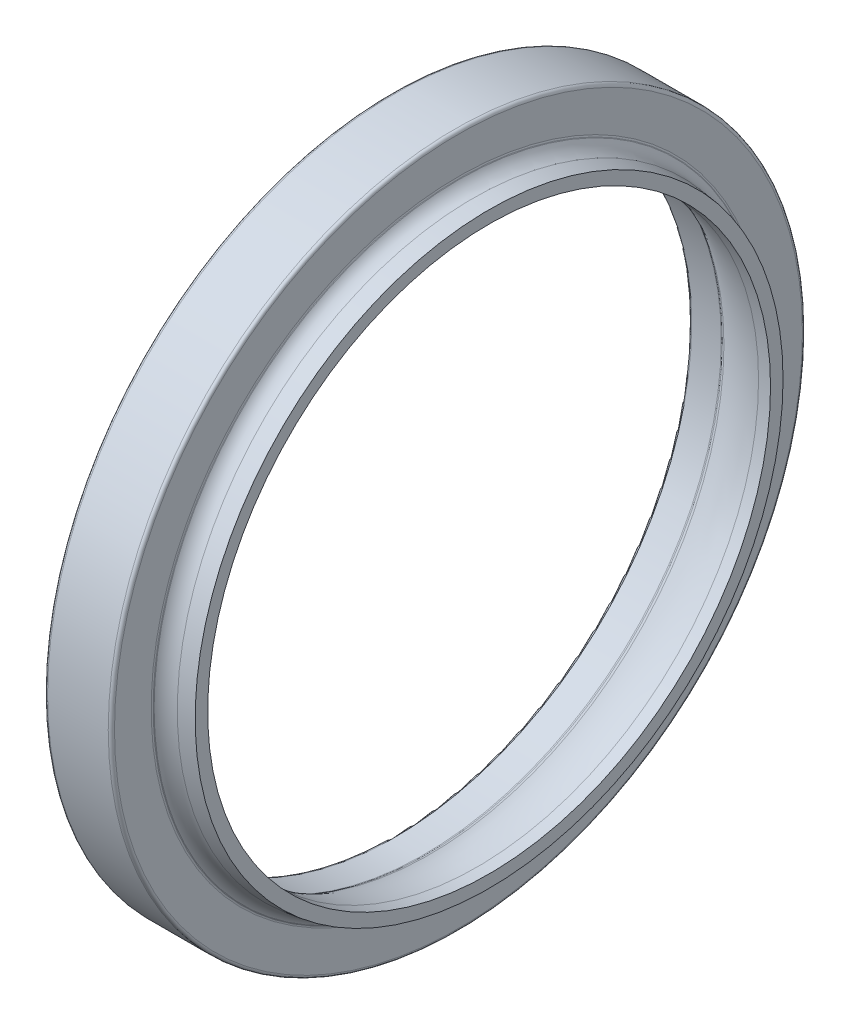
ISO-10303-21;
HEADER;
FILE_DESCRIPTION(('STEP AP214'),'2;1');
FILE_NAME('part.step','',(''),(''),'','','');
FILE_SCHEMA(('AUTOMOTIVE_DESIGN { 1 0 10303 214 1 1 1 1 }'));
ENDSEC;
DATA;
#1=APPLICATION_CONTEXT('core data for automotive mechanical design processes');
#2=APPLICATION_PROTOCOL_DEFINITION('international standard','automotive_design',2000,#1);
#3=PRODUCT_CONTEXT('',#1,'mechanical');
#4=PRODUCT('Part','Part','',(#3));
#5=PRODUCT_RELATED_PRODUCT_CATEGORY('part','',(#4));
#6=PRODUCT_DEFINITION_FORMATION('','',#4);
#7=PRODUCT_DEFINITION_CONTEXT('part definition',#1,'design');
#8=PRODUCT_DEFINITION('design','',#6,#7);
#9=PRODUCT_DEFINITION_SHAPE('','',#8);
#10=(LENGTH_UNIT() NAMED_UNIT(*) SI_UNIT(.MILLI.,.METRE.));
#11=(NAMED_UNIT(*) PLANE_ANGLE_UNIT() SI_UNIT($,.RADIAN.));
#12=(NAMED_UNIT(*) SI_UNIT($,.STERADIAN.) SOLID_ANGLE_UNIT());
#13=UNCERTAINTY_MEASURE_WITH_UNIT(LENGTH_MEASURE(1.E-05),#10,'distance_accuracy_value','');
#14=(GEOMETRIC_REPRESENTATION_CONTEXT(3) GLOBAL_UNCERTAINTY_ASSIGNED_CONTEXT((#13)) GLOBAL_UNIT_ASSIGNED_CONTEXT((#10,
#11,#12)) REPRESENTATION_CONTEXT('',''));
#15=CARTESIAN_POINT('',(0.,0.,0.));
#16=DIRECTION('',(0.,0.,1.));
#17=DIRECTION('',(1.,0.,0.));
#18=AXIS2_PLACEMENT_3D('',#15,#16,#17);
#19=CARTESIAN_POINT('',(7.8,0.,0.));
#20=DIRECTION('',(-1.,0.,0.));
#21=DIRECTION('',(0.,0.,1.));
#22=AXIS2_PLACEMENT_3D('',#19,#20,#21);
#23=CONICAL_SURFACE('',#22,23.5,0.122173047639613);
#24=CARTESIAN_POINT('',(6.52676783456753,0.,0.));
#25=DIRECTION('',(1.,0.,0.));
#26=DIRECTION('',(0.,0.,-1.));
#27=AXIS2_PLACEMENT_3D('',#24,#25,#26);
#28=CIRCLE('',#27,23.6563332523601);
#29=CARTESIAN_POINT('',(6.52676783456753,0.,-23.6563332523601));
#30=VERTEX_POINT('',#29);
#31=EDGE_CURVE('E108',#30,#30,#28,.T.);
#32=ORIENTED_EDGE('',*,*,#31,.T.);
#33=EDGE_LOOP('',(#32));
#34=FACE_BOUND('',#33,.T.);
#35=CARTESIAN_POINT('',(7.8,0.,0.));
#36=DIRECTION('',(1.,0.,0.));
#37=DIRECTION('',(0.,0.,-1.));
#38=AXIS2_PLACEMENT_3D('',#35,#36,#37);
#39=CIRCLE('',#38,23.5);
#40=CARTESIAN_POINT('',(7.8,0.,-23.5));
#41=VERTEX_POINT('',#40);
#42=EDGE_CURVE('E10',#41,#41,#39,.T.);
#43=ORIENTED_EDGE('',*,*,#42,.F.);
#44=EDGE_LOOP('',(#43));
#45=FACE_BOUND('',#44,.T.);
#46=ADVANCED_FACE('F41',(#34,#45),#23,.T.);
#47=CARTESIAN_POINT('',(7.8,0.,-23.5));
#48=DIRECTION('',(1.,0.,0.));
#49=DIRECTION('',(0.,0.,-1.));
#50=AXIS2_PLACEMENT_3D('',#47,#48,#49);
#51=PLANE('',#50);
#52=ORIENTED_EDGE('',*,*,#42,.T.);
#53=EDGE_LOOP('',(#52));
#54=FACE_BOUND('',#53,.T.);
#55=CARTESIAN_POINT('',(7.8,0.,0.));
#56=DIRECTION('',(1.,0.,0.));
#57=DIRECTION('',(0.,0.,-1.));
#58=AXIS2_PLACEMENT_3D('',#55,#56,#57);
#59=CIRCLE('',#58,22.5);
#60=CARTESIAN_POINT('',(7.8,0.,-22.5));
#61=VERTEX_POINT('',#60);
#62=EDGE_CURVE('E48',#61,#61,#59,.T.);
#63=ORIENTED_EDGE('',*,*,#62,.F.);
#64=EDGE_LOOP('',(#63));
#65=FACE_BOUND('',#64,.T.);
#66=ADVANCED_FACE('F127',(#54,#65),#51,.T.);
#67=CARTESIAN_POINT('',(88.99,0.,0.));
#68=DIRECTION('',(1.,0.,0.));
#69=DIRECTION('',(0.,0.,-1.));
#70=AXIS2_PLACEMENT_3D('',#67,#68,#69);
#71=CYLINDRICAL_SURFACE('',#70,22.5);
#72=ORIENTED_EDGE('',*,*,#62,.T.);
#73=EDGE_LOOP('',(#72));
#74=FACE_BOUND('',#73,.T.);
#75=CARTESIAN_POINT('',(6.84231219248702,0.,0.));
#76=DIRECTION('',(1.,0.,0.));
#77=DIRECTION('',(0.,0.,-1.));
#78=AXIS2_PLACEMENT_3D('',#75,#76,#77);
#79=CIRCLE('',#78,22.5);
#80=CARTESIAN_POINT('',(6.84231219248702,0.,-22.5));
#81=VERTEX_POINT('',#80);
#82=EDGE_CURVE('E53',#81,#81,#79,.T.);
#83=ORIENTED_EDGE('',*,*,#82,.F.);
#84=EDGE_LOOP('',(#83));
#85=FACE_BOUND('',#84,.T.);
#86=ADVANCED_FACE('F131',(#74,#85),#71,.F.);
#87=CARTESIAN_POINT('',(6.84231219248702,0.,0.));
#88=DIRECTION('',(1.,0.,0.));
#89=DIRECTION('',(0.,0.,-1.));
#90=AXIS2_PLACEMENT_3D('',#87,#88,#89);
#91=TOROIDAL_SURFACE('',#90,30.,7.5);
#92=ORIENTED_EDGE('',*,*,#82,.T.);
#93=EDGE_LOOP('',(#92));
#94=FACE_BOUND('',#93,.T.);
#95=CARTESIAN_POINT('',(3.03966124326156,0.,0.));
#96=DIRECTION('',(1.,0.,0.));
#97=DIRECTION('',(0.,0.,-1.));
#98=AXIS2_PLACEMENT_3D('',#95,#96,#97);
#99=CIRCLE('',#98,23.5354933863167);
#100=CARTESIAN_POINT('',(3.03966124326156,0.,-23.5354933863167));
#101=VERTEX_POINT('',#100);
#102=EDGE_CURVE('E58',#101,#101,#99,.T.);
#103=ORIENTED_EDGE('',*,*,#102,.F.);
#104=EDGE_LOOP('',(#103));
#105=FACE_BOUND('',#104,.T.);
#106=ADVANCED_FACE('F135',(#94,#105),#91,.T.);
#107=CARTESIAN_POINT('',(2.73367795855795,0.,0.));
#108=DIRECTION('',(-1.,0.,0.));
#109=DIRECTION('',(0.,0.,1.));
#110=AXIS2_PLACEMENT_3D('',#107,#108,#109);
#111=CONICAL_SURFACE('',#110,23.7154835537894,0.531724067258792);
#112=ORIENTED_EDGE('',*,*,#102,.T.);
#113=EDGE_LOOP('',(#112));
#114=FACE_BOUND('',#113,.T.);
#115=CARTESIAN_POINT('',(2.73367795855795,0.,0.));
#116=DIRECTION('',(1.,0.,0.));
#117=DIRECTION('',(0.,0.,-1.));
#118=AXIS2_PLACEMENT_3D('',#115,#116,#117);
#119=CIRCLE('',#118,23.7154835537894);
#120=CARTESIAN_POINT('',(2.73367795855795,0.,-23.7154835537894));
#121=VERTEX_POINT('',#120);
#122=EDGE_CURVE('E64',#121,#121,#119,.T.);
#123=ORIENTED_EDGE('',*,*,#122,.F.);
#124=EDGE_LOOP('',(#123));
#125=FACE_BOUND('',#124,.T.);
#126=ADVANCED_FACE('F141',(#114,#125),#111,.F.);
#127=CARTESIAN_POINT('',(2.6069229269171,0.,0.));
#128=DIRECTION('',(1.,0.,0.));
#129=DIRECTION('',(0.,0.,-1.));
#130=AXIS2_PLACEMENT_3D('',#127,#128,#129);
#131=TOROIDAL_SURFACE('',#130,23.5,0.25);
#132=ORIENTED_EDGE('',*,*,#122,.T.);
#133=EDGE_LOOP('',(#132));
#134=FACE_BOUND('',#133,.T.);
#135=CARTESIAN_POINT('',(2.6069229269171,0.,0.));
#136=DIRECTION('',(1.,0.,0.));
#137=DIRECTION('',(0.,0.,-1.));
#138=AXIS2_PLACEMENT_3D('',#135,#136,#137);
#139=CIRCLE('',#138,23.75);
#140=CARTESIAN_POINT('',(2.6069229269171,0.,-23.75));
#141=VERTEX_POINT('',#140);
#142=EDGE_CURVE('E68',#141,#141,#139,.T.);
#143=ORIENTED_EDGE('',*,*,#142,.F.);
#144=EDGE_LOOP('',(#143));
#145=FACE_BOUND('',#144,.T.);
#146=ADVANCED_FACE('F145',(#134,#145),#131,.F.);
#147=CARTESIAN_POINT('',(88.99,0.,0.));
#148=DIRECTION('',(1.,0.,0.));
#149=DIRECTION('',(0.,0.,-1.));
#150=AXIS2_PLACEMENT_3D('',#147,#148,#149);
#151=CYLINDRICAL_SURFACE('',#150,23.75);
#152=ORIENTED_EDGE('',*,*,#142,.T.);
#153=EDGE_LOOP('',(#152));
#154=FACE_BOUND('',#153,.T.);
#155=CARTESIAN_POINT('',(0.25,0.,0.));
#156=DIRECTION('',(1.,0.,0.));
#157=DIRECTION('',(0.,0.,-1.));
#158=AXIS2_PLACEMENT_3D('',#155,#156,#157);
#159=CIRCLE('',#158,23.75);
#160=CARTESIAN_POINT('',(0.25,0.,-23.75));
#161=VERTEX_POINT('',#160);
#162=EDGE_CURVE('E72',#161,#161,#159,.T.);
#163=ORIENTED_EDGE('',*,*,#162,.F.);
#164=EDGE_LOOP('',(#163));
#165=FACE_BOUND('',#164,.T.);
#166=ADVANCED_FACE('F149',(#154,#165),#151,.F.);
#167=CARTESIAN_POINT('',(0.25,0.,0.));
#168=DIRECTION('',(1.,0.,0.));
#169=DIRECTION('',(0.,0.,-1.));
#170=AXIS2_PLACEMENT_3D('',#167,#168,#169);
#171=TOROIDAL_SURFACE('',#170,24.,0.25);
#172=ORIENTED_EDGE('',*,*,#162,.T.);
#173=EDGE_LOOP('',(#172));
#174=FACE_BOUND('',#173,.T.);
#175=CARTESIAN_POINT('',(0.,0.,0.));
#176=DIRECTION('',(1.,0.,0.));
#177=DIRECTION('',(0.,0.,-1.));
#178=AXIS2_PLACEMENT_3D('',#175,#176,#177);
#179=CIRCLE('',#178,24.);
#180=CARTESIAN_POINT('',(0.,0.,-24.));
#181=VERTEX_POINT('',#180);
#182=EDGE_CURVE('E76',#181,#181,#179,.T.);
#183=ORIENTED_EDGE('',*,*,#182,.F.);
#184=EDGE_LOOP('',(#183));
#185=FACE_BOUND('',#184,.T.);
#186=ADVANCED_FACE('F153',(#174,#185),#171,.T.);
#187=CARTESIAN_POINT('',(0.,0.,-24.));
#188=DIRECTION('',(-1.,0.,0.));
#189=DIRECTION('',(0.,0.,1.));
#190=AXIS2_PLACEMENT_3D('',#187,#188,#189);
#191=PLANE('',#190);
#192=ORIENTED_EDGE('',*,*,#182,.T.);
#193=EDGE_LOOP('',(#192));
#194=FACE_BOUND('',#193,.T.);
#195=CARTESIAN_POINT('',(0.,0.,0.));
#196=DIRECTION('',(1.,0.,0.));
#197=DIRECTION('',(0.,0.,-1.));
#198=AXIS2_PLACEMENT_3D('',#195,#196,#197);
#199=CIRCLE('',#198,27.5);
#200=CARTESIAN_POINT('',(0.,0.,-27.5));
#201=VERTEX_POINT('',#200);
#202=EDGE_CURVE('E80',#201,#201,#199,.T.);
#203=ORIENTED_EDGE('',*,*,#202,.F.);
#204=EDGE_LOOP('',(#203));
#205=FACE_BOUND('',#204,.T.);
#206=ADVANCED_FACE('F157',(#194,#205),#191,.T.);
#207=CARTESIAN_POINT('',(0.25,0.,0.));
#208=DIRECTION('',(1.,0.,0.));
#209=DIRECTION('',(0.,0.,-1.));
#210=AXIS2_PLACEMENT_3D('',#207,#208,#209);
#211=TOROIDAL_SURFACE('',#210,27.5,0.25);
#212=ORIENTED_EDGE('',*,*,#202,.T.);
#213=EDGE_LOOP('',(#212));
#214=FACE_BOUND('',#213,.T.);
#215=CARTESIAN_POINT('',(0.25,0.,0.));
#216=DIRECTION('',(1.,0.,0.));
#217=DIRECTION('',(0.,0.,-1.));
#218=AXIS2_PLACEMENT_3D('',#215,#216,#217);
#219=CIRCLE('',#218,27.75);
#220=CARTESIAN_POINT('',(0.25,0.,-27.75));
#221=VERTEX_POINT('',#220);
#222=EDGE_CURVE('E84',#221,#221,#219,.T.);
#223=ORIENTED_EDGE('',*,*,#222,.F.);
#224=EDGE_LOOP('',(#223));
#225=FACE_BOUND('',#224,.T.);
#226=ADVANCED_FACE('F161',(#214,#225),#211,.T.);
#227=CARTESIAN_POINT('',(88.99,0.,0.));
#228=DIRECTION('',(1.,0.,0.));
#229=DIRECTION('',(0.,0.,-1.));
#230=AXIS2_PLACEMENT_3D('',#227,#228,#229);
#231=CYLINDRICAL_SURFACE('',#230,27.75);
#232=ORIENTED_EDGE('',*,*,#222,.T.);
#233=EDGE_LOOP('',(#232));
#234=FACE_BOUND('',#233,.T.);
#235=CARTESIAN_POINT('',(5.09999999999999,0.,0.));
#236=DIRECTION('',(1.,0.,0.));
#237=DIRECTION('',(0.,0.,-1.));
#238=AXIS2_PLACEMENT_3D('',#235,#236,#237);
#239=CIRCLE('',#238,27.75);
#240=CARTESIAN_POINT('',(5.09999999999999,0.,-27.75));
#241=VERTEX_POINT('',#240);
#242=EDGE_CURVE('E88',#241,#241,#239,.T.);
#243=ORIENTED_EDGE('',*,*,#242,.F.);
#244=EDGE_LOOP('',(#243));
#245=FACE_BOUND('',#244,.T.);
#246=ADVANCED_FACE('F165',(#234,#245),#231,.T.);
#247=CARTESIAN_POINT('',(5.1,0.,0.));
#248=DIRECTION('',(1.,0.,0.));
#249=DIRECTION('',(0.,0.,-1.));
#250=AXIS2_PLACEMENT_3D('',#247,#248,#249);
#251=TOROIDAL_SURFACE('',#250,27.5,0.25);
#252=ORIENTED_EDGE('',*,*,#242,.T.);
#253=EDGE_LOOP('',(#252));
#254=FACE_BOUND('',#253,.T.);
#255=CARTESIAN_POINT('',(5.34999999999999,0.,0.));
#256=DIRECTION('',(1.,0.,0.));
#257=DIRECTION('',(0.,0.,-1.));
#258=AXIS2_PLACEMENT_3D('',#255,#256,#257);
#259=CIRCLE('',#258,27.5);
#260=CARTESIAN_POINT('',(5.34999999999999,0.,-27.5));
#261=VERTEX_POINT('',#260);
#262=EDGE_CURVE('E92',#261,#261,#259,.T.);
#263=ORIENTED_EDGE('',*,*,#262,.F.);
#264=EDGE_LOOP('',(#263));
#265=FACE_BOUND('',#264,.T.);
#266=ADVANCED_FACE('F169',(#254,#265),#251,.T.);
#267=CARTESIAN_POINT('',(5.35,0.,-24.5669872981078));
#268=DIRECTION('',(1.,0.,0.));
#269=DIRECTION('',(0.,0.,-1.));
#270=AXIS2_PLACEMENT_3D('',#267,#268,#269);
#271=PLANE('',#270);
#272=ORIENTED_EDGE('',*,*,#262,.T.);
#273=EDGE_LOOP('',(#272));
#274=FACE_BOUND('',#273,.T.);
#275=CARTESIAN_POINT('',(5.34999999999999,0.,0.));
#276=DIRECTION('',(1.,0.,0.));
#277=DIRECTION('',(0.,0.,-1.));
#278=AXIS2_PLACEMENT_3D('',#275,#276,#277);
#279=CIRCLE('',#278,24.5669872981078);
#280=CARTESIAN_POINT('',(5.34999999999999,0.,-24.5669872981078));
#281=VERTEX_POINT('',#280);
#282=EDGE_CURVE('E96',#281,#281,#279,.T.);
#283=ORIENTED_EDGE('',*,*,#282,.F.);
#284=EDGE_LOOP('',(#283));
#285=FACE_BOUND('',#284,.T.);
#286=ADVANCED_FACE('F173',(#274,#285),#271,.T.);
#287=CARTESIAN_POINT('',(5.6,0.,0.));
#288=DIRECTION('',(1.,0.,0.));
#289=DIRECTION('',(0.,0.,-1.));
#290=AXIS2_PLACEMENT_3D('',#287,#288,#289);
#291=TOROIDAL_SURFACE('',#290,24.5669872981078,0.250000000000001);
#292=ORIENTED_EDGE('',*,*,#282,.T.);
#293=EDGE_LOOP('',(#292));
#294=FACE_BOUND('',#293,.T.);
#295=CARTESIAN_POINT('',(5.38349364905388,0.,0.));
#296=DIRECTION('',(1.,0.,0.));
#297=DIRECTION('',(0.,0.,-1.));
#298=AXIS2_PLACEMENT_3D('',#295,#296,#297);
#299=CIRCLE('',#298,24.4419872981078);
#300=CARTESIAN_POINT('',(5.38349364905388,0.,-24.4419872981078));
#301=VERTEX_POINT('',#300);
#302=EDGE_CURVE('E100',#301,#301,#299,.T.);
#303=ORIENTED_EDGE('',*,*,#302,.F.);
#304=EDGE_LOOP('',(#303));
#305=FACE_BOUND('',#304,.T.);
#306=ADVANCED_FACE('F123',(#294,#305),#291,.F.);
#307=CARTESIAN_POINT('',(5.41053374399859,0.,0.));
#308=DIRECTION('',(-1.,0.,0.));
#309=DIRECTION('',(0.,0.,1.));
#310=AXIS2_PLACEMENT_3D('',#307,#308,#309);
#311=CONICAL_SURFACE('',#310,24.3951524798221,1.04719755119641);
#312=ORIENTED_EDGE('',*,*,#302,.T.);
#313=EDGE_LOOP('',(#312));
#314=FACE_BOUND('',#313,.T.);
#315=CARTESIAN_POINT('',(5.41053374399859,0.,0.));
#316=DIRECTION('',(1.,0.,0.));
#317=DIRECTION('',(0.,0.,-1.));
#318=AXIS2_PLACEMENT_3D('',#315,#316,#317);
#319=CIRCLE('',#318,24.3951524798221);
#320=CARTESIAN_POINT('',(5.41053374399859,0.,-24.3951524798221));
#321=VERTEX_POINT('',#320);
#322=EDGE_CURVE('E104',#321,#321,#319,.T.);
#323=ORIENTED_EDGE('',*,*,#322,.F.);
#324=EDGE_LOOP('',(#323));
#325=FACE_BOUND('',#324,.T.);
#326=ADVANCED_FACE('F117',(#314,#325),#311,.T.);
#327=CARTESIAN_POINT('',(6.70957184967525,0.,0.));
#328=DIRECTION('',(1.,0.,0.));
#329=DIRECTION('',(0.,0.,-1.));
#330=AXIS2_PLACEMENT_3D('',#327,#328,#329);
#331=TOROIDAL_SURFACE('',#330,25.1451524798221,1.5);
#332=ORIENTED_EDGE('',*,*,#322,.T.);
#333=EDGE_LOOP('',(#332));
#334=FACE_BOUND('',#333,.T.);
#335=ORIENTED_EDGE('',*,*,#31,.F.);
#336=EDGE_LOOP('',(#335));
#337=FACE_BOUND('',#336,.T.);
#338=ADVANCED_FACE('F115',(#334,#337),#331,.F.);
#339=CLOSED_SHELL('',(#46,#66,#86,#106,#126,#146,#166,#186,#206,#226,#246,#266,#286,#306,#326,#338));
#340=MANIFOLD_SOLID_BREP('B2',#339);
#341=ADVANCED_BREP_SHAPE_REPRESENTATION('',(#18,#340),#14);
#342=SHAPE_DEFINITION_REPRESENTATION(#9,#341);
ENDSEC;
END-ISO-10303-21;
